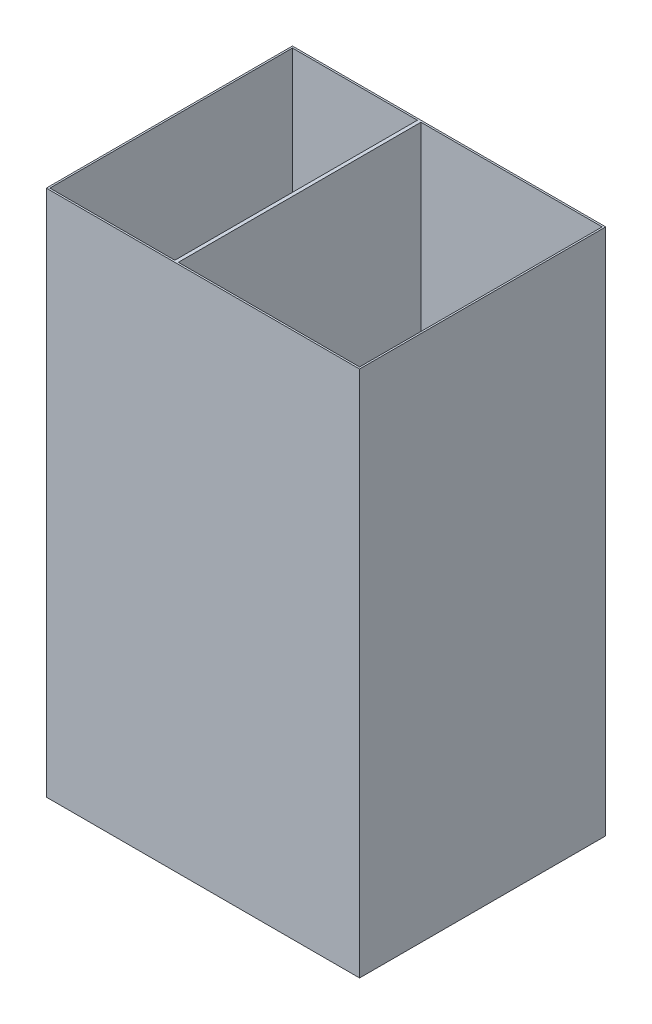
ISO-10303-21;
HEADER;
FILE_DESCRIPTION(('STEP AP214'),'2;1');
FILE_NAME('part.step','',(''),(''),'','','');
FILE_SCHEMA(('AUTOMOTIVE_DESIGN { 1 0 10303 214 1 1 1 1 }'));
ENDSEC;
DATA;
#1=APPLICATION_CONTEXT('core data for automotive mechanical design processes');
#2=APPLICATION_PROTOCOL_DEFINITION('international standard','automotive_design',2000,#1);
#3=PRODUCT_CONTEXT('',#1,'mechanical');
#4=PRODUCT('Part','Part','',(#3));
#5=PRODUCT_RELATED_PRODUCT_CATEGORY('part','',(#4));
#6=PRODUCT_DEFINITION_FORMATION('','',#4);
#7=PRODUCT_DEFINITION_CONTEXT('part definition',#1,'design');
#8=PRODUCT_DEFINITION('design','',#6,#7);
#9=PRODUCT_DEFINITION_SHAPE('','',#8);
#10=(LENGTH_UNIT() NAMED_UNIT(*) SI_UNIT(.MILLI.,.METRE.));
#11=(NAMED_UNIT(*) PLANE_ANGLE_UNIT() SI_UNIT($,.RADIAN.));
#12=(NAMED_UNIT(*) SI_UNIT($,.STERADIAN.) SOLID_ANGLE_UNIT());
#13=UNCERTAINTY_MEASURE_WITH_UNIT(LENGTH_MEASURE(1.E-05),#10,'distance_accuracy_value','');
#14=(GEOMETRIC_REPRESENTATION_CONTEXT(3) GLOBAL_UNCERTAINTY_ASSIGNED_CONTEXT((#13)) GLOBAL_UNIT_ASSIGNED_CONTEXT((#10,
#11,#12)) REPRESENTATION_CONTEXT('',''));
#15=CARTESIAN_POINT('',(0.,0.,0.));
#16=DIRECTION('',(0.,0.,1.));
#17=DIRECTION('',(1.,0.,0.));
#18=AXIS2_PLACEMENT_3D('',#15,#16,#17);
#19=CARTESIAN_POINT('',(0.,150.,0.));
#20=DIRECTION('',(0.,-1.,0.));
#21=DIRECTION('',(0.,0.,-1.));
#22=AXIS2_PLACEMENT_3D('',#19,#20,#21);
#23=PLANE('',#22);
#24=DIRECTION('',(-1.,0.,0.));
#25=VECTOR('',#24,1.);
#26=CARTESIAN_POINT('',(-7.5,150.,-34.5));
#27=LINE('',#26,#25);
#28=CARTESIAN_POINT('',(44.05,150.,-34.5));
#29=VERTEX_POINT('',#28);
#30=CARTESIAN_POINT('',(-7.5,150.,-34.5));
#31=VERTEX_POINT('',#30);
#32=EDGE_CURVE('E160',#29,#31,#27,.T.);
#33=ORIENTED_EDGE('',*,*,#32,.F.);
#34=DIRECTION('',(0.,0.,-1.));
#35=VECTOR('',#34,1.);
#36=CARTESIAN_POINT('',(44.05,150.,34.5));
#37=LINE('',#36,#35);
#38=CARTESIAN_POINT('',(44.05,150.,34.5));
#39=VERTEX_POINT('',#38);
#40=EDGE_CURVE('E168',#39,#29,#37,.T.);
#41=ORIENTED_EDGE('',*,*,#40,.F.);
#42=DIRECTION('',(1.,0.,0.));
#43=VECTOR('',#42,1.);
#44=CARTESIAN_POINT('',(-7.49999999999999,150.,34.5));
#45=LINE('',#44,#43);
#46=CARTESIAN_POINT('',(-7.49999999999999,150.,34.5));
#47=VERTEX_POINT('',#46);
#48=EDGE_CURVE('E165',#47,#39,#45,.T.);
#49=ORIENTED_EDGE('',*,*,#48,.F.);
#50=DIRECTION('',(0.,0.,1.));
#51=VECTOR('',#50,1.);
#52=CARTESIAN_POINT('',(-7.5,150.,-34.5));
#53=LINE('',#52,#51);
#54=EDGE_CURVE('E162',#31,#47,#53,.T.);
#55=ORIENTED_EDGE('',*,*,#54,.F.);
#56=EDGE_LOOP('',(#33,#41,#49,#55));
#57=FACE_BOUND('',#56,.T.);
#58=DIRECTION('',(0.,0.,-1.));
#59=VECTOR('',#58,1.);
#60=CARTESIAN_POINT('',(44.55,150.,35.));
#61=LINE('',#60,#59);
#62=CARTESIAN_POINT('',(44.55,150.,35.));
#63=VERTEX_POINT('',#62);
#64=CARTESIAN_POINT('',(44.55,150.,-35.));
#65=VERTEX_POINT('',#64);
#66=EDGE_CURVE('E191',#63,#65,#61,.T.);
#67=ORIENTED_EDGE('',*,*,#66,.T.);
#68=DIRECTION('',(-1.,0.,0.));
#69=VECTOR('',#68,1.);
#70=CARTESIAN_POINT('',(-44.55,150.,-35.));
#71=LINE('',#70,#69);
#72=CARTESIAN_POINT('',(-44.55,150.,-35.));
#73=VERTEX_POINT('',#72);
#74=EDGE_CURVE('E194',#65,#73,#71,.T.);
#75=ORIENTED_EDGE('',*,*,#74,.T.);
#76=DIRECTION('',(0.,0.,1.));
#77=VECTOR('',#76,1.);
#78=CARTESIAN_POINT('',(-44.55,150.,35.));
#79=LINE('',#78,#77);
#80=CARTESIAN_POINT('',(-44.55,150.,35.));
#81=VERTEX_POINT('',#80);
#82=EDGE_CURVE('E197',#73,#81,#79,.T.);
#83=ORIENTED_EDGE('',*,*,#82,.T.);
#84=DIRECTION('',(1.,0.,0.));
#85=VECTOR('',#84,1.);
#86=CARTESIAN_POINT('',(-44.55,150.,35.));
#87=LINE('',#86,#85);
#88=EDGE_CURVE('E199',#81,#63,#87,.T.);
#89=ORIENTED_EDGE('',*,*,#88,.T.);
#90=EDGE_LOOP('',(#67,#75,#83,#89));
#91=FACE_BOUND('',#90,.T.);
#92=DIRECTION('',(0.,0.,1.));
#93=VECTOR('',#92,1.);
#94=CARTESIAN_POINT('',(-44.05,150.,34.5));
#95=LINE('',#94,#93);
#96=CARTESIAN_POINT('',(-44.05,150.,-34.5));
#97=VERTEX_POINT('',#96);
#98=CARTESIAN_POINT('',(-44.05,150.,34.5));
#99=VERTEX_POINT('',#98);
#100=EDGE_CURVE('E122',#97,#99,#95,.T.);
#101=ORIENTED_EDGE('',*,*,#100,.F.);
#102=DIRECTION('',(-1.,0.,0.));
#103=VECTOR('',#102,1.);
#104=CARTESIAN_POINT('',(-44.05,150.,-34.5));
#105=LINE('',#104,#103);
#106=CARTESIAN_POINT('',(-8.5,150.,-34.5));
#107=VERTEX_POINT('',#106);
#108=EDGE_CURVE('E144',#107,#97,#105,.T.);
#109=ORIENTED_EDGE('',*,*,#108,.F.);
#110=DIRECTION('',(0.,0.,-1.));
#111=VECTOR('',#110,1.);
#112=CARTESIAN_POINT('',(-8.5,150.,-34.5));
#113=LINE('',#112,#111);
#114=CARTESIAN_POINT('',(-8.49999999999999,150.,34.5));
#115=VERTEX_POINT('',#114);
#116=EDGE_CURVE('E142',#115,#107,#113,.T.);
#117=ORIENTED_EDGE('',*,*,#116,.F.);
#118=DIRECTION('',(1.,0.,0.));
#119=VECTOR('',#118,1.);
#120=CARTESIAN_POINT('',(-44.05,150.,34.5));
#121=LINE('',#120,#119);
#122=EDGE_CURVE('E130',#99,#115,#121,.T.);
#123=ORIENTED_EDGE('',*,*,#122,.F.);
#124=EDGE_LOOP('',(#101,#109,#117,#123));
#125=FACE_BOUND('',#124,.T.);
#126=ADVANCED_FACE('F33',(#57,#91,#125),#23,.F.);
#127=CARTESIAN_POINT('',(0.,0.,0.));
#128=DIRECTION('',(0.,-1.,0.));
#129=DIRECTION('',(0.,0.,-1.));
#130=AXIS2_PLACEMENT_3D('',#127,#128,#129);
#131=PLANE('',#130);
#132=DIRECTION('',(0.,0.,-1.));
#133=VECTOR('',#132,1.);
#134=CARTESIAN_POINT('',(44.55,0.,35.));
#135=LINE('',#134,#133);
#136=CARTESIAN_POINT('',(44.55,0.,35.));
#137=VERTEX_POINT('',#136);
#138=CARTESIAN_POINT('',(44.55,0.,-35.));
#139=VERTEX_POINT('',#138);
#140=EDGE_CURVE('E190',#137,#139,#135,.T.);
#141=ORIENTED_EDGE('',*,*,#140,.F.);
#142=DIRECTION('',(1.,0.,0.));
#143=VECTOR('',#142,1.);
#144=CARTESIAN_POINT('',(-44.55,0.,35.));
#145=LINE('',#144,#143);
#146=CARTESIAN_POINT('',(-44.55,0.,35.));
#147=VERTEX_POINT('',#146);
#148=EDGE_CURVE('E195',#147,#137,#145,.T.);
#149=ORIENTED_EDGE('',*,*,#148,.F.);
#150=DIRECTION('',(0.,0.,1.));
#151=VECTOR('',#150,1.);
#152=CARTESIAN_POINT('',(-44.55,0.,35.));
#153=LINE('',#152,#151);
#154=CARTESIAN_POINT('',(-44.55,0.,-35.));
#155=VERTEX_POINT('',#154);
#156=EDGE_CURVE('E206',#155,#147,#153,.T.);
#157=ORIENTED_EDGE('',*,*,#156,.F.);
#158=DIRECTION('',(-1.,0.,0.));
#159=VECTOR('',#158,1.);
#160=CARTESIAN_POINT('',(-44.55,0.,-35.));
#161=LINE('',#160,#159);
#162=EDGE_CURVE('E204',#139,#155,#161,.T.);
#163=ORIENTED_EDGE('',*,*,#162,.F.);
#164=EDGE_LOOP('',(#141,#149,#157,#163));
#165=FACE_BOUND('',#164,.T.);
#166=DIRECTION('',(0.,0.,-1.));
#167=VECTOR('',#166,1.);
#168=CARTESIAN_POINT('',(44.05,0.,34.5));
#169=LINE('',#168,#167);
#170=CARTESIAN_POINT('',(44.05,0.,34.5));
#171=VERTEX_POINT('',#170);
#172=CARTESIAN_POINT('',(44.05,0.,-34.5));
#173=VERTEX_POINT('',#172);
#174=EDGE_CURVE('E163',#171,#173,#169,.T.);
#175=ORIENTED_EDGE('',*,*,#174,.T.);
#176=DIRECTION('',(-1.,0.,0.));
#177=VECTOR('',#176,1.);
#178=CARTESIAN_POINT('',(-7.5,0.,-34.5));
#179=LINE('',#178,#177);
#180=CARTESIAN_POINT('',(-7.5,0.,-34.5));
#181=VERTEX_POINT('',#180);
#182=EDGE_CURVE('E138',#173,#181,#179,.T.);
#183=ORIENTED_EDGE('',*,*,#182,.T.);
#184=DIRECTION('',(0.,0.,1.));
#185=VECTOR('',#184,1.);
#186=CARTESIAN_POINT('',(-7.5,0.,-34.5));
#187=LINE('',#186,#185);
#188=CARTESIAN_POINT('',(-7.49999999999999,0.,34.5));
#189=VERTEX_POINT('',#188);
#190=EDGE_CURVE('E173',#181,#189,#187,.T.);
#191=ORIENTED_EDGE('',*,*,#190,.T.);
#192=DIRECTION('',(1.,0.,0.));
#193=VECTOR('',#192,1.);
#194=CARTESIAN_POINT('',(-7.49999999999999,0.,34.5));
#195=LINE('',#194,#193);
#196=EDGE_CURVE('E176',#189,#171,#195,.T.);
#197=ORIENTED_EDGE('',*,*,#196,.T.);
#198=EDGE_LOOP('',(#175,#183,#191,#197));
#199=FACE_BOUND('',#198,.T.);
#200=DIRECTION('',(-1.,0.,0.));
#201=VECTOR('',#200,1.);
#202=CARTESIAN_POINT('',(-44.05,0.,-34.5));
#203=LINE('',#202,#201);
#204=CARTESIAN_POINT('',(-8.5,0.,-34.5));
#205=VERTEX_POINT('',#204);
#206=CARTESIAN_POINT('',(-44.05,0.,-34.5));
#207=VERTEX_POINT('',#206);
#208=EDGE_CURVE('E131',#205,#207,#203,.T.);
#209=ORIENTED_EDGE('',*,*,#208,.T.);
#210=DIRECTION('',(0.,0.,1.));
#211=VECTOR('',#210,1.);
#212=CARTESIAN_POINT('',(-44.05,0.,34.5));
#213=LINE('',#212,#211);
#214=CARTESIAN_POINT('',(-44.05,0.,34.5));
#215=VERTEX_POINT('',#214);
#216=EDGE_CURVE('E56',#207,#215,#213,.T.);
#217=ORIENTED_EDGE('',*,*,#216,.T.);
#218=DIRECTION('',(1.,0.,0.));
#219=VECTOR('',#218,1.);
#220=CARTESIAN_POINT('',(-44.05,0.,34.5));
#221=LINE('',#220,#219);
#222=CARTESIAN_POINT('',(-8.49999999999999,0.,34.5));
#223=VERTEX_POINT('',#222);
#224=EDGE_CURVE('E137',#215,#223,#221,.T.);
#225=ORIENTED_EDGE('',*,*,#224,.T.);
#226=DIRECTION('',(0.,0.,-1.));
#227=VECTOR('',#226,1.);
#228=CARTESIAN_POINT('',(-8.5,0.,-34.5));
#229=LINE('',#228,#227);
#230=EDGE_CURVE('E152',#223,#205,#229,.T.);
#231=ORIENTED_EDGE('',*,*,#230,.T.);
#232=EDGE_LOOP('',(#209,#217,#225,#231));
#233=FACE_BOUND('',#232,.T.);
#234=ADVANCED_FACE('F224',(#165,#199,#233),#131,.T.);
#235=CARTESIAN_POINT('',(44.55,150.,35.));
#236=DIRECTION('',(-1.,0.,0.));
#237=DIRECTION('',(0.,0.,1.));
#238=AXIS2_PLACEMENT_3D('',#235,#236,#237);
#239=PLANE('',#238);
#240=ORIENTED_EDGE('',*,*,#140,.T.);
#241=DIRECTION('',(0.,-1.,0.));
#242=VECTOR('',#241,1.);
#243=CARTESIAN_POINT('',(44.55,150.,-35.));
#244=LINE('',#243,#242);
#245=EDGE_CURVE('E11',#65,#139,#244,.T.);
#246=ORIENTED_EDGE('',*,*,#245,.F.);
#247=ORIENTED_EDGE('',*,*,#66,.F.);
#248=DIRECTION('',(0.,-1.,0.));
#249=VECTOR('',#248,1.);
#250=CARTESIAN_POINT('',(44.55,150.,35.));
#251=LINE('',#250,#249);
#252=EDGE_CURVE('E201',#63,#137,#251,.T.);
#253=ORIENTED_EDGE('',*,*,#252,.T.);
#254=EDGE_LOOP('',(#240,#246,#247,#253));
#255=FACE_BOUND('',#254,.T.);
#256=ADVANCED_FACE('F35',(#255),#239,.F.);
#257=CARTESIAN_POINT('',(-44.55,150.,-35.));
#258=DIRECTION('',(0.,0.,1.));
#259=DIRECTION('',(1.,0.,0.));
#260=AXIS2_PLACEMENT_3D('',#257,#258,#259);
#261=PLANE('',#260);
#262=ORIENTED_EDGE('',*,*,#162,.T.);
#263=DIRECTION('',(0.,-1.,0.));
#264=VECTOR('',#263,1.);
#265=CARTESIAN_POINT('',(-44.55,150.,-35.));
#266=LINE('',#265,#264);
#267=EDGE_CURVE('E41',#73,#155,#266,.T.);
#268=ORIENTED_EDGE('',*,*,#267,.F.);
#269=ORIENTED_EDGE('',*,*,#74,.F.);
#270=ORIENTED_EDGE('',*,*,#245,.T.);
#271=EDGE_LOOP('',(#262,#268,#269,#270));
#272=FACE_BOUND('',#271,.T.);
#273=ADVANCED_FACE('F234',(#272),#261,.F.);
#274=CARTESIAN_POINT('',(-44.55,150.,35.));
#275=DIRECTION('',(1.,0.,0.));
#276=DIRECTION('',(0.,0.,-1.));
#277=AXIS2_PLACEMENT_3D('',#274,#275,#276);
#278=PLANE('',#277);
#279=ORIENTED_EDGE('',*,*,#156,.T.);
#280=DIRECTION('',(0.,-1.,0.));
#281=VECTOR('',#280,1.);
#282=CARTESIAN_POINT('',(-44.55,150.,35.));
#283=LINE('',#282,#281);
#284=EDGE_CURVE('E211',#81,#147,#283,.T.);
#285=ORIENTED_EDGE('',*,*,#284,.F.);
#286=ORIENTED_EDGE('',*,*,#82,.F.);
#287=ORIENTED_EDGE('',*,*,#267,.T.);
#288=EDGE_LOOP('',(#279,#285,#286,#287));
#289=FACE_BOUND('',#288,.T.);
#290=ADVANCED_FACE('F218',(#289),#278,.F.);
#291=CARTESIAN_POINT('',(-44.55,150.,35.));
#292=DIRECTION('',(0.,0.,-1.));
#293=DIRECTION('',(-1.,0.,0.));
#294=AXIS2_PLACEMENT_3D('',#291,#292,#293);
#295=PLANE('',#294);
#296=ORIENTED_EDGE('',*,*,#148,.T.);
#297=ORIENTED_EDGE('',*,*,#252,.F.);
#298=ORIENTED_EDGE('',*,*,#88,.F.);
#299=ORIENTED_EDGE('',*,*,#284,.T.);
#300=EDGE_LOOP('',(#296,#297,#298,#299));
#301=FACE_BOUND('',#300,.T.);
#302=ADVANCED_FACE('F228',(#301),#295,.F.);
#303=CARTESIAN_POINT('',(-7.5,150.,-34.5));
#304=DIRECTION('',(0.,0.,1.));
#305=DIRECTION('',(1.,0.,0.));
#306=AXIS2_PLACEMENT_3D('',#303,#304,#305);
#307=PLANE('',#306);
#308=ORIENTED_EDGE('',*,*,#182,.F.);
#309=DIRECTION('',(0.,-1.,0.));
#310=VECTOR('',#309,1.);
#311=CARTESIAN_POINT('',(44.05,150.,-34.5));
#312=LINE('',#311,#310);
#313=EDGE_CURVE('E170',#29,#173,#312,.T.);
#314=ORIENTED_EDGE('',*,*,#313,.F.);
#315=ORIENTED_EDGE('',*,*,#32,.T.);
#316=DIRECTION('',(0.,-1.,0.));
#317=VECTOR('',#316,1.);
#318=CARTESIAN_POINT('',(-7.5,150.,-34.5));
#319=LINE('',#318,#317);
#320=EDGE_CURVE('E187',#31,#181,#319,.T.);
#321=ORIENTED_EDGE('',*,*,#320,.T.);
#322=EDGE_LOOP('',(#308,#314,#315,#321));
#323=FACE_BOUND('',#322,.T.);
#324=ADVANCED_FACE('F250',(#323),#307,.T.);
#325=CARTESIAN_POINT('',(-7.5,150.,-34.5));
#326=DIRECTION('',(1.,0.,0.));
#327=DIRECTION('',(0.,0.,-1.));
#328=AXIS2_PLACEMENT_3D('',#325,#326,#327);
#329=PLANE('',#328);
#330=CARTESIAN_POINT('',(-7.49999999999999,75.0345511142585,17.5));
#331=DIRECTION('',(1.,0.,0.));
#332=DIRECTION('',(0.,0.,-1.));
#333=AXIS2_PLACEMENT_3D('',#330,#331,#332);
#334=CIRCLE('',#333,2.);
#335=CARTESIAN_POINT('',(-7.49999999999999,75.0345511142585,15.5));
#336=VERTEX_POINT('',#335);
#337=EDGE_CURVE('E313',#336,#336,#334,.T.);
#338=ORIENTED_EDGE('',*,*,#337,.F.);
#339=EDGE_LOOP('',(#338));
#340=FACE_BOUND('',#339,.T.);
#341=CARTESIAN_POINT('',(-7.5,75.0345511142585,-17.5));
#342=DIRECTION('',(1.,0.,0.));
#343=DIRECTION('',(0.,0.,-1.));
#344=AXIS2_PLACEMENT_3D('',#341,#342,#343);
#345=CIRCLE('',#344,2.);
#346=CARTESIAN_POINT('',(-7.5,75.0345511142585,-19.5));
#347=VERTEX_POINT('',#346);
#348=EDGE_CURVE('E318',#347,#347,#345,.T.);
#349=ORIENTED_EDGE('',*,*,#348,.F.);
#350=EDGE_LOOP('',(#349));
#351=FACE_BOUND('',#350,.T.);
#352=CARTESIAN_POINT('',(-7.5,83.0345511142585,0.));
#353=DIRECTION('',(1.,0.,0.));
#354=DIRECTION('',(0.,0.,-1.));
#355=AXIS2_PLACEMENT_3D('',#352,#353,#354);
#356=CIRCLE('',#355,4.5);
#357=CARTESIAN_POINT('',(-7.5,83.0345511142585,-4.5));
#358=VERTEX_POINT('',#357);
#359=EDGE_CURVE('E325',#358,#358,#356,.T.);
#360=ORIENTED_EDGE('',*,*,#359,.F.);
#361=EDGE_LOOP('',(#360));
#362=FACE_BOUND('',#361,.T.);
#363=ORIENTED_EDGE('',*,*,#190,.F.);
#364=ORIENTED_EDGE('',*,*,#320,.F.);
#365=ORIENTED_EDGE('',*,*,#54,.T.);
#366=DIRECTION('',(0.,-1.,0.));
#367=VECTOR('',#366,1.);
#368=CARTESIAN_POINT('',(-7.49999999999999,150.,34.5));
#369=LINE('',#368,#367);
#370=EDGE_CURVE('E185',#47,#189,#369,.T.);
#371=ORIENTED_EDGE('',*,*,#370,.T.);
#372=EDGE_LOOP('',(#363,#364,#365,#371));
#373=FACE_BOUND('',#372,.T.);
#374=ADVANCED_FACE('F257',(#340,#351,#362,#373),#329,.T.);
#375=CARTESIAN_POINT('',(-7.49999999999999,150.,34.5));
#376=DIRECTION('',(0.,0.,-1.));
#377=DIRECTION('',(-1.,0.,0.));
#378=AXIS2_PLACEMENT_3D('',#375,#376,#377);
#379=PLANE('',#378);
#380=ORIENTED_EDGE('',*,*,#196,.F.);
#381=ORIENTED_EDGE('',*,*,#370,.F.);
#382=ORIENTED_EDGE('',*,*,#48,.T.);
#383=DIRECTION('',(0.,-1.,0.));
#384=VECTOR('',#383,1.);
#385=CARTESIAN_POINT('',(44.05,150.,34.5));
#386=LINE('',#385,#384);
#387=EDGE_CURVE('E183',#39,#171,#386,.T.);
#388=ORIENTED_EDGE('',*,*,#387,.T.);
#389=EDGE_LOOP('',(#380,#381,#382,#388));
#390=FACE_BOUND('',#389,.T.);
#391=ADVANCED_FACE('F262',(#390),#379,.T.);
#392=CARTESIAN_POINT('',(44.05,150.,34.5));
#393=DIRECTION('',(-1.,0.,0.));
#394=DIRECTION('',(0.,0.,1.));
#395=AXIS2_PLACEMENT_3D('',#392,#393,#394);
#396=PLANE('',#395);
#397=ORIENTED_EDGE('',*,*,#174,.F.);
#398=ORIENTED_EDGE('',*,*,#387,.F.);
#399=ORIENTED_EDGE('',*,*,#40,.T.);
#400=ORIENTED_EDGE('',*,*,#313,.T.);
#401=EDGE_LOOP('',(#397,#398,#399,#400));
#402=FACE_BOUND('',#401,.T.);
#403=ADVANCED_FACE('F268',(#402),#396,.T.);
#404=CARTESIAN_POINT('',(-44.05,150.,34.5));
#405=DIRECTION('',(1.,0.,0.));
#406=DIRECTION('',(0.,0.,-1.));
#407=AXIS2_PLACEMENT_3D('',#404,#405,#406);
#408=PLANE('',#407);
#409=ORIENTED_EDGE('',*,*,#216,.F.);
#410=DIRECTION('',(0.,-1.,0.));
#411=VECTOR('',#410,1.);
#412=CARTESIAN_POINT('',(-44.05,150.,-34.5));
#413=LINE('',#412,#411);
#414=EDGE_CURVE('E126',#97,#207,#413,.T.);
#415=ORIENTED_EDGE('',*,*,#414,.F.);
#416=ORIENTED_EDGE('',*,*,#100,.T.);
#417=DIRECTION('',(0.,-1.,0.));
#418=VECTOR('',#417,1.);
#419=CARTESIAN_POINT('',(-44.05,150.,34.5));
#420=LINE('',#419,#418);
#421=EDGE_CURVE('E125',#99,#215,#420,.T.);
#422=ORIENTED_EDGE('',*,*,#421,.T.);
#423=EDGE_LOOP('',(#409,#415,#416,#422));
#424=FACE_BOUND('',#423,.T.);
#425=ADVANCED_FACE('F124',(#424),#408,.T.);
#426=CARTESIAN_POINT('',(-44.05,150.,34.5));
#427=DIRECTION('',(0.,0.,-1.));
#428=DIRECTION('',(-1.,0.,0.));
#429=AXIS2_PLACEMENT_3D('',#426,#427,#428);
#430=PLANE('',#429);
#431=ORIENTED_EDGE('',*,*,#224,.F.);
#432=ORIENTED_EDGE('',*,*,#421,.F.);
#433=ORIENTED_EDGE('',*,*,#122,.T.);
#434=DIRECTION('',(0.,-1.,0.));
#435=VECTOR('',#434,1.);
#436=CARTESIAN_POINT('',(-8.49999999999999,150.,34.5));
#437=LINE('',#436,#435);
#438=EDGE_CURVE('E139',#115,#223,#437,.T.);
#439=ORIENTED_EDGE('',*,*,#438,.T.);
#440=EDGE_LOOP('',(#431,#432,#433,#439));
#441=FACE_BOUND('',#440,.T.);
#442=ADVANCED_FACE('F134',(#441),#430,.T.);
#443=CARTESIAN_POINT('',(-8.5,150.,-34.5));
#444=DIRECTION('',(-1.,0.,0.));
#445=DIRECTION('',(0.,0.,1.));
#446=AXIS2_PLACEMENT_3D('',#443,#444,#445);
#447=PLANE('',#446);
#448=CARTESIAN_POINT('',(-8.49999999999999,75.0345511142585,17.5));
#449=DIRECTION('',(1.,0.,0.));
#450=DIRECTION('',(0.,0.,-1.));
#451=AXIS2_PLACEMENT_3D('',#448,#449,#450);
#452=CIRCLE('',#451,2.);
#453=CARTESIAN_POINT('',(-8.49999999999999,75.0345511142585,15.5));
#454=VERTEX_POINT('',#453);
#455=EDGE_CURVE('E150',#454,#454,#452,.T.);
#456=ORIENTED_EDGE('',*,*,#455,.T.);
#457=EDGE_LOOP('',(#456));
#458=FACE_BOUND('',#457,.T.);
#459=CARTESIAN_POINT('',(-8.5,75.0345511142585,-17.5));
#460=DIRECTION('',(1.,0.,0.));
#461=DIRECTION('',(0.,0.,-1.));
#462=AXIS2_PLACEMENT_3D('',#459,#460,#461);
#463=CIRCLE('',#462,2.);
#464=CARTESIAN_POINT('',(-8.5,75.0345511142585,-19.5));
#465=VERTEX_POINT('',#464);
#466=EDGE_CURVE('E314',#465,#465,#463,.T.);
#467=ORIENTED_EDGE('',*,*,#466,.T.);
#468=EDGE_LOOP('',(#467));
#469=FACE_BOUND('',#468,.T.);
#470=CARTESIAN_POINT('',(-8.5,83.0345511142585,0.));
#471=DIRECTION('',(1.,0.,0.));
#472=DIRECTION('',(0.,0.,-1.));
#473=AXIS2_PLACEMENT_3D('',#470,#471,#472);
#474=CIRCLE('',#473,4.5);
#475=CARTESIAN_POINT('',(-8.5,83.0345511142585,-4.5));
#476=VERTEX_POINT('',#475);
#477=EDGE_CURVE('E323',#476,#476,#474,.T.);
#478=ORIENTED_EDGE('',*,*,#477,.T.);
#479=EDGE_LOOP('',(#478));
#480=FACE_BOUND('',#479,.T.);
#481=ORIENTED_EDGE('',*,*,#230,.F.);
#482=ORIENTED_EDGE('',*,*,#438,.F.);
#483=ORIENTED_EDGE('',*,*,#116,.T.);
#484=DIRECTION('',(0.,-1.,0.));
#485=VECTOR('',#484,1.);
#486=CARTESIAN_POINT('',(-8.5,150.,-34.5));
#487=LINE('',#486,#485);
#488=EDGE_CURVE('E48',#107,#205,#487,.T.);
#489=ORIENTED_EDGE('',*,*,#488,.T.);
#490=EDGE_LOOP('',(#481,#482,#483,#489));
#491=FACE_BOUND('',#490,.T.);
#492=ADVANCED_FACE('F288',(#458,#469,#480,#491),#447,.T.);
#493=CARTESIAN_POINT('',(-44.05,150.,-34.5));
#494=DIRECTION('',(0.,0.,1.));
#495=DIRECTION('',(1.,0.,0.));
#496=AXIS2_PLACEMENT_3D('',#493,#494,#495);
#497=PLANE('',#496);
#498=ORIENTED_EDGE('',*,*,#208,.F.);
#499=ORIENTED_EDGE('',*,*,#488,.F.);
#500=ORIENTED_EDGE('',*,*,#108,.T.);
#501=ORIENTED_EDGE('',*,*,#414,.T.);
#502=EDGE_LOOP('',(#498,#499,#500,#501));
#503=FACE_BOUND('',#502,.T.);
#504=ADVANCED_FACE('F291',(#503),#497,.T.);
#505=CARTESIAN_POINT('',(-8.5,83.0345511142585,0.));
#506=DIRECTION('',(1.,0.,0.));
#507=DIRECTION('',(0.,0.,-1.));
#508=AXIS2_PLACEMENT_3D('',#505,#506,#507);
#509=CYLINDRICAL_SURFACE('',#508,4.5);
#510=ORIENTED_EDGE('',*,*,#477,.F.);
#511=EDGE_LOOP('',(#510));
#512=FACE_BOUND('',#511,.T.);
#513=ORIENTED_EDGE('',*,*,#359,.T.);
#514=EDGE_LOOP('',(#513));
#515=FACE_BOUND('',#514,.T.);
#516=ADVANCED_FACE('F295',(#512,#515),#509,.F.);
#517=CARTESIAN_POINT('',(-8.5,75.0345511142585,-17.5));
#518=DIRECTION('',(1.,0.,0.));
#519=DIRECTION('',(0.,0.,-1.));
#520=AXIS2_PLACEMENT_3D('',#517,#518,#519);
#521=CYLINDRICAL_SURFACE('',#520,2.);
#522=ORIENTED_EDGE('',*,*,#466,.F.);
#523=EDGE_LOOP('',(#522));
#524=FACE_BOUND('',#523,.T.);
#525=ORIENTED_EDGE('',*,*,#348,.T.);
#526=EDGE_LOOP('',(#525));
#527=FACE_BOUND('',#526,.T.);
#528=ADVANCED_FACE('F298',(#524,#527),#521,.F.);
#529=CARTESIAN_POINT('',(-8.49999999999999,75.0345511142585,17.5));
#530=DIRECTION('',(1.,0.,0.));
#531=DIRECTION('',(0.,0.,-1.));
#532=AXIS2_PLACEMENT_3D('',#529,#530,#531);
#533=CYLINDRICAL_SURFACE('',#532,2.);
#534=ORIENTED_EDGE('',*,*,#455,.F.);
#535=EDGE_LOOP('',(#534));
#536=FACE_BOUND('',#535,.T.);
#537=ORIENTED_EDGE('',*,*,#337,.T.);
#538=EDGE_LOOP('',(#537));
#539=FACE_BOUND('',#538,.T.);
#540=ADVANCED_FACE('F302',(#536,#539),#533,.F.);
#541=CLOSED_SHELL('',(#126,#234,#256,#273,#290,#302,#324,#374,#391,#403,#425,#442,#492,#504,
#516,#528,#540));
#542=MANIFOLD_SOLID_BREP('B2',#541);
#543=ADVANCED_BREP_SHAPE_REPRESENTATION('',(#18,#542),#14);
#544=SHAPE_DEFINITION_REPRESENTATION(#9,#543);
ENDSEC;
END-ISO-10303-21;
